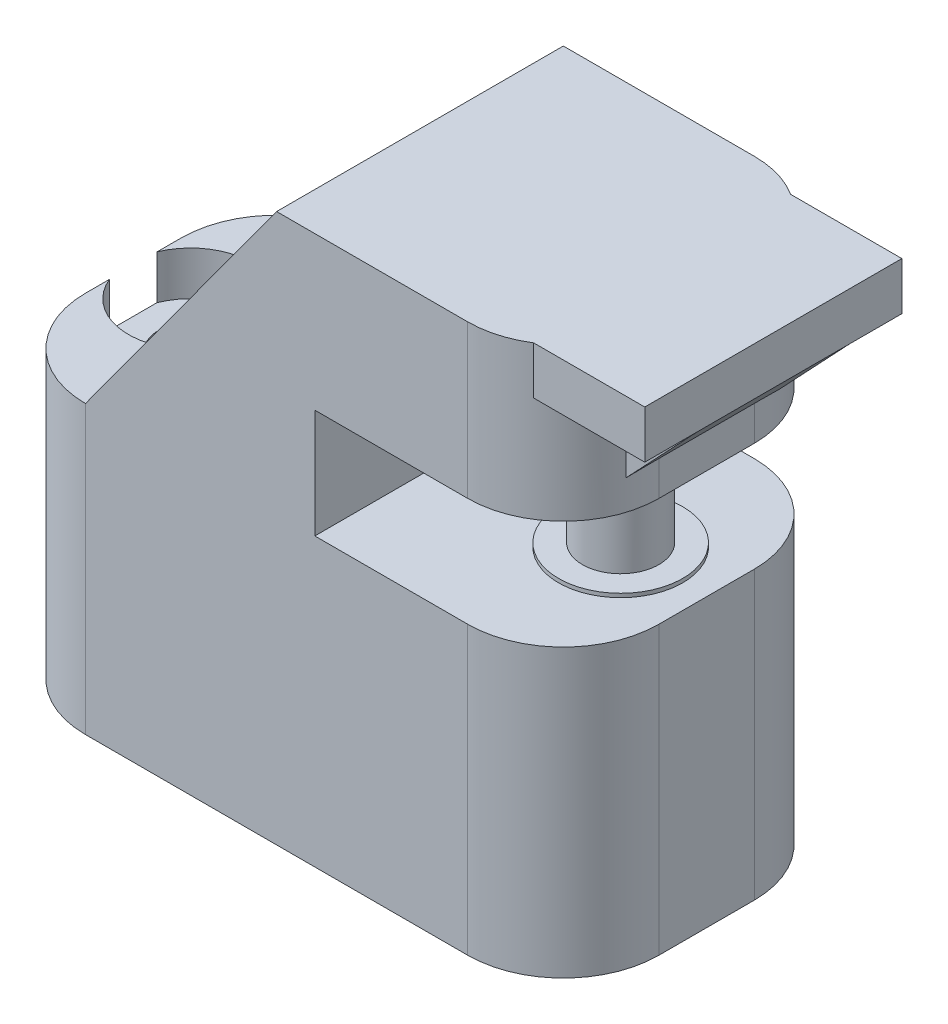
ISO-10303-21;
HEADER;
FILE_DESCRIPTION(('STEP AP214'),'2;1');
FILE_NAME('part.step','',(''),(''),'','','');
FILE_SCHEMA(('AUTOMOTIVE_DESIGN { 1 0 10303 214 1 1 1 1 }'));
ENDSEC;
DATA;
#1=APPLICATION_CONTEXT('core data for automotive mechanical design processes');
#2=APPLICATION_PROTOCOL_DEFINITION('international standard','automotive_design',2000,#1);
#3=PRODUCT_CONTEXT('',#1,'mechanical');
#4=PRODUCT('Part','Part','',(#3));
#5=PRODUCT_RELATED_PRODUCT_CATEGORY('part','',(#4));
#6=PRODUCT_DEFINITION_FORMATION('','',#4);
#7=PRODUCT_DEFINITION_CONTEXT('part definition',#1,'design');
#8=PRODUCT_DEFINITION('design','',#6,#7);
#9=PRODUCT_DEFINITION_SHAPE('','',#8);
#10=(LENGTH_UNIT() NAMED_UNIT(*) SI_UNIT(.MILLI.,.METRE.));
#11=(NAMED_UNIT(*) PLANE_ANGLE_UNIT() SI_UNIT($,.RADIAN.));
#12=(NAMED_UNIT(*) SI_UNIT($,.STERADIAN.) SOLID_ANGLE_UNIT());
#13=UNCERTAINTY_MEASURE_WITH_UNIT(LENGTH_MEASURE(1.E-05),#10,'distance_accuracy_value','');
#14=(GEOMETRIC_REPRESENTATION_CONTEXT(3) GLOBAL_UNCERTAINTY_ASSIGNED_CONTEXT((#13)) GLOBAL_UNIT_ASSIGNED_CONTEXT((#10,
#11,#12)) REPRESENTATION_CONTEXT('',''));
#15=CARTESIAN_POINT('',(0.,0.,0.));
#16=DIRECTION('',(0.,0.,1.));
#17=DIRECTION('',(1.,0.,0.));
#18=AXIS2_PLACEMENT_3D('',#15,#16,#17);
#19=CARTESIAN_POINT('',(0.,26.2,0.));
#20=DIRECTION('',(0.,-1.,0.));
#21=DIRECTION('',(0.,0.,-1.));
#22=AXIS2_PLACEMENT_3D('',#19,#20,#21);
#23=PLANE('',#22);
#24=DIRECTION('',(0.,0.,-1.));
#25=VECTOR('',#24,1.);
#26=CARTESIAN_POINT('',(33.4869107559231,26.2,0.77421994503107));
#27=LINE('',#26,#25);
#28=CARTESIAN_POINT('',(33.4869107559231,26.2,3.5));
#29=VERTEX_POINT('',#28);
#30=CARTESIAN_POINT('',(33.4869107559231,26.2,0.77421994503107));
#31=VERTEX_POINT('',#30);
#32=EDGE_CURVE('E233',#29,#31,#27,.T.);
#33=ORIENTED_EDGE('',*,*,#32,.F.);
#34=DIRECTION('',(-1.,0.,0.));
#35=VECTOR('',#34,1.);
#36=CARTESIAN_POINT('',(0.,26.2,3.5));
#37=LINE('',#36,#35);
#38=CARTESIAN_POINT('',(29.7696960070847,26.2,3.5));
#39=VERTEX_POINT('',#38);
#40=EDGE_CURVE('E57',#29,#39,#37,.T.);
#41=ORIENTED_EDGE('',*,*,#40,.T.);
#42=CARTESIAN_POINT('',(25.,26.2,5.));
#43=DIRECTION('',(0.,-1.,0.));
#44=DIRECTION('',(0.,0.,-1.));
#45=AXIS2_PLACEMENT_3D('',#42,#43,#44);
#46=CIRCLE('',#45,5.);
#47=CARTESIAN_POINT('',(27.6725985345777,26.2,0.774219945031071));
#48=VERTEX_POINT('',#47);
#49=EDGE_CURVE('E262',#39,#48,#46,.F.);
#50=ORIENTED_EDGE('',*,*,#49,.T.);
#51=DIRECTION('',(-1.,0.,0.));
#52=VECTOR('',#51,1.);
#53=CARTESIAN_POINT('',(33.4869107559231,26.2,0.77421994503107));
#54=LINE('',#53,#52);
#55=EDGE_CURVE('E235',#31,#48,#54,.T.);
#56=ORIENTED_EDGE('',*,*,#55,.F.);
#57=EDGE_LOOP('',(#33,#41,#50,#56));
#58=FACE_BOUND('',#57,.T.);
#59=ADVANCED_FACE('F49',(#58),#23,.T.);
#60=CARTESIAN_POINT('',(0.,15.,15.));
#61=DIRECTION('',(0.,-1.,0.));
#62=DIRECTION('',(0.,0.,-1.));
#63=AXIS2_PLACEMENT_3D('',#60,#61,#62);
#64=PLANE('',#63);
#65=DIRECTION('',(0.,0.,-1.));
#66=VECTOR('',#65,1.);
#67=CARTESIAN_POINT('',(5.,15.,15.));
#68=LINE('',#67,#66);
#69=CARTESIAN_POINT('',(5.,15.,15.));
#70=VERTEX_POINT('',#69);
#71=CARTESIAN_POINT('',(5.,15.,10.0617376914899));
#72=VERTEX_POINT('',#71);
#73=EDGE_CURVE('E374',#70,#72,#68,.T.);
#74=ORIENTED_EDGE('',*,*,#73,.T.);
#75=CARTESIAN_POINT('',(3.,15.,7.5));
#76=DIRECTION('',(0.,-1.,0.));
#77=DIRECTION('',(0.,0.,-1.));
#78=AXIS2_PLACEMENT_3D('',#75,#76,#77);
#79=CIRCLE('',#78,3.25);
#80=CARTESIAN_POINT('',(0.,15.,8.74999999999999));
#81=VERTEX_POINT('',#80);
#82=EDGE_CURVE('E494',#72,#81,#79,.T.);
#83=ORIENTED_EDGE('',*,*,#82,.T.);
#84=DIRECTION('',(0.,0.,-1.));
#85=VECTOR('',#84,1.);
#86=CARTESIAN_POINT('',(0.,15.,15.));
#87=LINE('',#86,#85);
#88=CARTESIAN_POINT('',(0.,15.,10.));
#89=VERTEX_POINT('',#88);
#90=EDGE_CURVE('E369',#89,#81,#87,.T.);
#91=ORIENTED_EDGE('',*,*,#90,.F.);
#92=CARTESIAN_POINT('',(5.,15.,10.));
#93=DIRECTION('',(0.,-1.,0.));
#94=DIRECTION('',(0.,0.,-1.));
#95=AXIS2_PLACEMENT_3D('',#92,#93,#94);
#96=CIRCLE('',#95,5.);
#97=EDGE_CURVE('E437',#89,#70,#96,.F.);
#98=ORIENTED_EDGE('',*,*,#97,.T.);
#99=EDGE_LOOP('',(#74,#83,#91,#98));
#100=FACE_BOUND('',#99,.T.);
#101=ADVANCED_FACE('F564',(#100),#64,.F.);
#102=CARTESIAN_POINT('',(30.,0.,15.));
#103=DIRECTION('',(0.,1.,0.));
#104=DIRECTION('',(-1.,0.,0.));
#105=AXIS2_PLACEMENT_3D('',#102,#103,#104);
#106=PLANE('',#105);
#107=CARTESIAN_POINT('',(10.,0.,7.5));
#108=DIRECTION('',(0.,1.,0.));
#109=DIRECTION('',(0.,0.,1.));
#110=AXIS2_PLACEMENT_3D('',#107,#108,#109);
#111=CIRCLE('',#110,1.69999999999999);
#112=CARTESIAN_POINT('',(10.,0.,9.19999999999999));
#113=VERTEX_POINT('',#112);
#114=EDGE_CURVE('E300',#113,#113,#111,.T.);
#115=ORIENTED_EDGE('',*,*,#114,.T.);
#116=EDGE_LOOP('',(#115));
#117=FACE_BOUND('',#116,.T.);
#118=CARTESIAN_POINT('',(5.,0.,10.));
#119=DIRECTION('',(0.,1.,0.));
#120=DIRECTION('',(-1.,0.,0.));
#121=AXIS2_PLACEMENT_3D('',#118,#119,#120);
#122=CIRCLE('',#121,5.);
#123=CARTESIAN_POINT('',(5.,0.,15.));
#124=VERTEX_POINT('',#123);
#125=CARTESIAN_POINT('',(0.,0.,10.));
#126=VERTEX_POINT('',#125);
#127=EDGE_CURVE('E421',#124,#126,#122,.F.);
#128=ORIENTED_EDGE('',*,*,#127,.T.);
#129=DIRECTION('',(0.,0.,-1.));
#130=VECTOR('',#129,1.);
#131=CARTESIAN_POINT('',(0.,0.,15.));
#132=LINE('',#131,#130);
#133=CARTESIAN_POINT('',(0.,0.,5.));
#134=VERTEX_POINT('',#133);
#135=EDGE_CURVE('E341',#126,#134,#132,.T.);
#136=ORIENTED_EDGE('',*,*,#135,.T.);
#137=CARTESIAN_POINT('',(5.,0.,5.));
#138=DIRECTION('',(0.,1.,0.));
#139=DIRECTION('',(-1.,0.,0.));
#140=AXIS2_PLACEMENT_3D('',#137,#138,#139);
#141=CIRCLE('',#140,5.);
#142=CARTESIAN_POINT('',(5.,0.,0.));
#143=VERTEX_POINT('',#142);
#144=EDGE_CURVE('E424',#134,#143,#141,.F.);
#145=ORIENTED_EDGE('',*,*,#144,.T.);
#146=DIRECTION('',(1.,0.,0.));
#147=VECTOR('',#146,1.);
#148=CARTESIAN_POINT('',(30.,0.,0.));
#149=LINE('',#148,#147);
#150=CARTESIAN_POINT('',(25.,0.,0.));
#151=VERTEX_POINT('',#150);
#152=EDGE_CURVE('E342',#143,#151,#149,.T.);
#153=ORIENTED_EDGE('',*,*,#152,.T.);
#154=CARTESIAN_POINT('',(25.,0.,5.));
#155=DIRECTION('',(0.,1.,0.));
#156=DIRECTION('',(-1.,0.,0.));
#157=AXIS2_PLACEMENT_3D('',#154,#155,#156);
#158=CIRCLE('',#157,5.);
#159=CARTESIAN_POINT('',(30.,0.,5.));
#160=VERTEX_POINT('',#159);
#161=EDGE_CURVE('E418',#151,#160,#158,.F.);
#162=ORIENTED_EDGE('',*,*,#161,.T.);
#163=DIRECTION('',(0.,0.,-1.));
#164=VECTOR('',#163,1.);
#165=CARTESIAN_POINT('',(30.,0.,15.));
#166=LINE('',#165,#164);
#167=CARTESIAN_POINT('',(30.,0.,10.));
#168=VERTEX_POINT('',#167);
#169=EDGE_CURVE('E394',#168,#160,#166,.T.);
#170=ORIENTED_EDGE('',*,*,#169,.F.);
#171=CARTESIAN_POINT('',(25.,0.,10.));
#172=DIRECTION('',(0.,1.,0.));
#173=DIRECTION('',(-1.,0.,0.));
#174=AXIS2_PLACEMENT_3D('',#171,#172,#173);
#175=CIRCLE('',#174,5.);
#176=CARTESIAN_POINT('',(25.,0.,15.));
#177=VERTEX_POINT('',#176);
#178=EDGE_CURVE('E415',#168,#177,#175,.F.);
#179=ORIENTED_EDGE('',*,*,#178,.T.);
#180=DIRECTION('',(1.,0.,0.));
#181=VECTOR('',#180,1.);
#182=CARTESIAN_POINT('',(30.,0.,15.));
#183=LINE('',#182,#181);
#184=EDGE_CURVE('E319',#124,#177,#183,.T.);
#185=ORIENTED_EDGE('',*,*,#184,.F.);
#186=EDGE_LOOP('',(#128,#136,#145,#153,#162,#170,#179,#185));
#187=FACE_BOUND('',#186,.T.);
#188=CARTESIAN_POINT('',(3.,0.,7.5));
#189=DIRECTION('',(0.,1.,0.));
#190=DIRECTION('',(0.,0.,1.));
#191=AXIS2_PLACEMENT_3D('',#188,#189,#190);
#192=CIRCLE('',#191,1.69999999999999);
#193=CARTESIAN_POINT('',(3.,0.,9.19999999999999));
#194=VERTEX_POINT('',#193);
#195=EDGE_CURVE('E278',#194,#194,#192,.T.);
#196=ORIENTED_EDGE('',*,*,#195,.T.);
#197=EDGE_LOOP('',(#196));
#198=FACE_BOUND('',#197,.T.);
#199=ADVANCED_FACE('F568',(#117,#187,#198),#106,.F.);
#200=CARTESIAN_POINT('',(30.,15.,15.));
#201=DIRECTION('',(-1.,0.,0.));
#202=DIRECTION('',(0.,-1.,0.));
#203=AXIS2_PLACEMENT_3D('',#200,#201,#202);
#204=PLANE('',#203);
#205=ORIENTED_EDGE('',*,*,#169,.T.);
#206=DIRECTION('',(0.,1.,0.));
#207=VECTOR('',#206,1.);
#208=CARTESIAN_POINT('',(30.,15.,5.));
#209=LINE('',#208,#207);
#210=CARTESIAN_POINT('',(30.,15.,5.));
#211=VERTEX_POINT('',#210);
#212=EDGE_CURVE('E478',#160,#211,#209,.T.);
#213=ORIENTED_EDGE('',*,*,#212,.T.);
#214=DIRECTION('',(0.,0.,-1.));
#215=VECTOR('',#214,1.);
#216=CARTESIAN_POINT('',(30.,15.,15.));
#217=LINE('',#216,#215);
#218=CARTESIAN_POINT('',(30.,15.,10.));
#219=VERTEX_POINT('',#218);
#220=EDGE_CURVE('E390',#219,#211,#217,.T.);
#221=ORIENTED_EDGE('',*,*,#220,.F.);
#222=DIRECTION('',(0.,1.,0.));
#223=VECTOR('',#222,1.);
#224=CARTESIAN_POINT('',(30.,15.,10.));
#225=LINE('',#224,#223);
#226=EDGE_CURVE('E475',#219,#168,#225,.F.);
#227=ORIENTED_EDGE('',*,*,#226,.T.);
#228=EDGE_LOOP('',(#205,#213,#221,#227));
#229=FACE_BOUND('',#228,.T.);
#230=ADVANCED_FACE('F890',(#229),#204,.F.);
#231=CARTESIAN_POINT('',(17.,15.,15.));
#232=DIRECTION('',(0.,-1.,0.));
#233=DIRECTION('',(0.,0.,-1.));
#234=AXIS2_PLACEMENT_3D('',#231,#232,#233);
#235=PLANE('',#234);
#236=CARTESIAN_POINT('',(25.5,15.,7.5));
#237=DIRECTION('',(0.,-1.,0.));
#238=DIRECTION('',(0.,0.,-1.));
#239=AXIS2_PLACEMENT_3D('',#236,#237,#238);
#240=CIRCLE('',#239,3.25);
#241=CARTESIAN_POINT('',(25.5,15.,4.25));
#242=VERTEX_POINT('',#241);
#243=EDGE_CURVE('E398',#242,#242,#240,.F.);
#244=ORIENTED_EDGE('',*,*,#243,.F.);
#245=EDGE_LOOP('',(#244));
#246=FACE_BOUND('',#245,.T.);
#247=DIRECTION('',(-1.,0.,0.));
#248=VECTOR('',#247,1.);
#249=CARTESIAN_POINT('',(17.,15.,0.));
#250=LINE('',#249,#248);
#251=CARTESIAN_POINT('',(25.,15.,0.));
#252=VERTEX_POINT('',#251);
#253=CARTESIAN_POINT('',(17.,15.,0.));
#254=VERTEX_POINT('',#253);
#255=EDGE_CURVE('E346',#252,#254,#250,.T.);
#256=ORIENTED_EDGE('',*,*,#255,.T.);
#257=DIRECTION('',(0.,0.,-1.));
#258=VECTOR('',#257,1.);
#259=CARTESIAN_POINT('',(17.,15.,15.));
#260=LINE('',#259,#258);
#261=CARTESIAN_POINT('',(17.,15.,15.));
#262=VERTEX_POINT('',#261);
#263=EDGE_CURVE('E387',#262,#254,#260,.T.);
#264=ORIENTED_EDGE('',*,*,#263,.F.);
#265=DIRECTION('',(-1.,0.,0.));
#266=VECTOR('',#265,1.);
#267=CARTESIAN_POINT('',(17.,15.,15.));
#268=LINE('',#267,#266);
#269=CARTESIAN_POINT('',(25.,15.,15.));
#270=VERTEX_POINT('',#269);
#271=EDGE_CURVE('E323',#270,#262,#268,.T.);
#272=ORIENTED_EDGE('',*,*,#271,.F.);
#273=CARTESIAN_POINT('',(25.,15.,10.));
#274=DIRECTION('',(0.,-1.,0.));
#275=DIRECTION('',(0.,0.,-1.));
#276=AXIS2_PLACEMENT_3D('',#273,#274,#275);
#277=CIRCLE('',#276,5.);
#278=EDGE_CURVE('E482',#270,#219,#277,.F.);
#279=ORIENTED_EDGE('',*,*,#278,.T.);
#280=ORIENTED_EDGE('',*,*,#220,.T.);
#281=CARTESIAN_POINT('',(25.,15.,5.));
#282=DIRECTION('',(0.,-1.,0.));
#283=DIRECTION('',(0.,0.,-1.));
#284=AXIS2_PLACEMENT_3D('',#281,#282,#283);
#285=CIRCLE('',#284,5.);
#286=EDGE_CURVE('E485',#211,#252,#285,.F.);
#287=ORIENTED_EDGE('',*,*,#286,.T.);
#288=EDGE_LOOP('',(#256,#264,#272,#279,#280,#287));
#289=FACE_BOUND('',#288,.T.);
#290=ADVANCED_FACE('F881',(#246,#289),#235,.F.);
#291=CARTESIAN_POINT('',(17.,20.7,15.));
#292=DIRECTION('',(-1.,0.,0.));
#293=DIRECTION('',(0.,-1.,0.));
#294=AXIS2_PLACEMENT_3D('',#291,#292,#293);
#295=PLANE('',#294);
#296=ORIENTED_EDGE('',*,*,#263,.T.);
#297=DIRECTION('',(0.,1.,0.));
#298=VECTOR('',#297,1.);
#299=CARTESIAN_POINT('',(17.,20.7,0.));
#300=LINE('',#299,#298);
#301=CARTESIAN_POINT('',(17.,20.7,0.));
#302=VERTEX_POINT('',#301);
#303=EDGE_CURVE('E350',#254,#302,#300,.T.);
#304=ORIENTED_EDGE('',*,*,#303,.T.);
#305=DIRECTION('',(0.,0.,-1.));
#306=VECTOR('',#305,1.);
#307=CARTESIAN_POINT('',(17.,20.7,15.));
#308=LINE('',#307,#306);
#309=CARTESIAN_POINT('',(17.,20.7,15.));
#310=VERTEX_POINT('',#309);
#311=EDGE_CURVE('E384',#310,#302,#308,.T.);
#312=ORIENTED_EDGE('',*,*,#311,.F.);
#313=DIRECTION('',(0.,1.,0.));
#314=VECTOR('',#313,1.);
#315=CARTESIAN_POINT('',(17.,20.7,15.));
#316=LINE('',#315,#314);
#317=EDGE_CURVE('E327',#262,#310,#316,.T.);
#318=ORIENTED_EDGE('',*,*,#317,.F.);
#319=EDGE_LOOP('',(#296,#304,#312,#318));
#320=FACE_BOUND('',#319,.T.);
#321=ADVANCED_FACE('F534',(#320),#295,.F.);
#322=CARTESIAN_POINT('',(30.,20.7,15.));
#323=DIRECTION('',(0.,1.,0.));
#324=DIRECTION('',(0.,0.,1.));
#325=AXIS2_PLACEMENT_3D('',#322,#323,#324);
#326=PLANE('',#325);
#327=CARTESIAN_POINT('',(25.5,20.7,7.5));
#328=DIRECTION('',(0.,1.,0.));
#329=DIRECTION('',(-1.,0.,0.));
#330=AXIS2_PLACEMENT_3D('',#327,#328,#329);
#331=CIRCLE('',#330,3.25);
#332=CARTESIAN_POINT('',(22.25,20.7,7.5));
#333=VERTEX_POINT('',#332);
#334=EDGE_CURVE('E310',#333,#333,#331,.T.);
#335=ORIENTED_EDGE('',*,*,#334,.T.);
#336=EDGE_LOOP('',(#335));
#337=FACE_BOUND('',#336,.T.);
#338=ORIENTED_EDGE('',*,*,#311,.T.);
#339=DIRECTION('',(1.,0.,0.));
#340=VECTOR('',#339,1.);
#341=CARTESIAN_POINT('',(30.,20.7,0.));
#342=LINE('',#341,#340);
#343=CARTESIAN_POINT('',(25.,20.7,0.));
#344=VERTEX_POINT('',#343);
#345=EDGE_CURVE('E354',#302,#344,#342,.T.);
#346=ORIENTED_EDGE('',*,*,#345,.T.);
#347=CARTESIAN_POINT('',(25.,20.7,5.));
#348=DIRECTION('',(0.,1.,0.));
#349=DIRECTION('',(0.,0.,1.));
#350=AXIS2_PLACEMENT_3D('',#347,#348,#349);
#351=CIRCLE('',#350,5.);
#352=CARTESIAN_POINT('',(30.,20.7,5.));
#353=VERTEX_POINT('',#352);
#354=EDGE_CURVE('E472',#344,#353,#351,.F.);
#355=ORIENTED_EDGE('',*,*,#354,.T.);
#356=DIRECTION('',(0.,0.,-1.));
#357=VECTOR('',#356,1.);
#358=CARTESIAN_POINT('',(30.,20.7,15.));
#359=LINE('',#358,#357);
#360=CARTESIAN_POINT('',(30.,20.7,10.));
#361=VERTEX_POINT('',#360);
#362=EDGE_CURVE('E380',#361,#353,#359,.T.);
#363=ORIENTED_EDGE('',*,*,#362,.F.);
#364=CARTESIAN_POINT('',(25.,20.7,10.));
#365=DIRECTION('',(0.,1.,0.));
#366=DIRECTION('',(0.,0.,1.));
#367=AXIS2_PLACEMENT_3D('',#364,#365,#366);
#368=CIRCLE('',#367,5.);
#369=CARTESIAN_POINT('',(25.,20.7,15.));
#370=VERTEX_POINT('',#369);
#371=EDGE_CURVE('E469',#361,#370,#368,.F.);
#372=ORIENTED_EDGE('',*,*,#371,.T.);
#373=DIRECTION('',(1.,0.,0.));
#374=VECTOR('',#373,1.);
#375=CARTESIAN_POINT('',(30.,20.7,15.));
#376=LINE('',#375,#374);
#377=EDGE_CURVE('E330',#310,#370,#376,.T.);
#378=ORIENTED_EDGE('',*,*,#377,.F.);
#379=EDGE_LOOP('',(#338,#346,#355,#363,#372,#378));
#380=FACE_BOUND('',#379,.T.);
#381=ADVANCED_FACE('F525',(#337,#380),#326,.F.);
#382=CARTESIAN_POINT('',(30.,28.7,15.));
#383=DIRECTION('',(-1.,0.,0.));
#384=DIRECTION('',(0.,0.,1.));
#385=AXIS2_PLACEMENT_3D('',#382,#383,#384);
#386=PLANE('',#385);
#387=DIRECTION('',(0.,1.,0.));
#388=VECTOR('',#387,1.);
#389=CARTESIAN_POINT('',(30.,28.7,5.));
#390=LINE('',#389,#388);
#391=CARTESIAN_POINT('',(30.,22.50746824119,5.));
#392=VERTEX_POINT('',#391);
#393=EDGE_CURVE('E458',#353,#392,#390,.T.);
#394=ORIENTED_EDGE('',*,*,#393,.T.);
#395=DIRECTION('',(0.,0.,-1.));
#396=VECTOR('',#395,1.);
#397=CARTESIAN_POINT('',(30.,22.50746824119,15.));
#398=LINE('',#397,#396);
#399=CARTESIAN_POINT('',(30.,22.50746824119,10.));
#400=VERTEX_POINT('',#399);
#401=EDGE_CURVE('E513',#392,#400,#398,.F.);
#402=ORIENTED_EDGE('',*,*,#401,.T.);
#403=DIRECTION('',(0.,1.,0.));
#404=VECTOR('',#403,1.);
#405=CARTESIAN_POINT('',(30.,28.7,10.));
#406=LINE('',#405,#404);
#407=EDGE_CURVE('E455',#400,#361,#406,.F.);
#408=ORIENTED_EDGE('',*,*,#407,.T.);
#409=ORIENTED_EDGE('',*,*,#362,.T.);
#410=EDGE_LOOP('',(#394,#402,#408,#409));
#411=FACE_BOUND('',#410,.T.);
#412=ADVANCED_FACE('F518',(#411),#386,.F.);
#413=CARTESIAN_POINT('',(15.,28.7,15.));
#414=DIRECTION('',(0.,-1.,0.));
#415=DIRECTION('',(0.,0.,-1.));
#416=AXIS2_PLACEMENT_3D('',#413,#414,#415);
#417=PLANE('',#416);
#418=DIRECTION('',(0.,0.,-1.));
#419=VECTOR('',#418,1.);
#420=CARTESIAN_POINT('',(33.4869107559231,28.7,0.77421994503107));
#421=LINE('',#420,#419);
#422=CARTESIAN_POINT('',(33.4869107559231,28.7,14.2257800549689));
#423=VERTEX_POINT('',#422);
#424=CARTESIAN_POINT('',(33.4869107559231,28.7,0.77421994503107));
#425=VERTEX_POINT('',#424);
#426=EDGE_CURVE('E253',#423,#425,#421,.T.);
#427=ORIENTED_EDGE('',*,*,#426,.T.);
#428=DIRECTION('',(-1.,0.,0.));
#429=VECTOR('',#428,1.);
#430=CARTESIAN_POINT('',(33.4869107559231,28.7,0.77421994503107));
#431=LINE('',#430,#429);
#432=CARTESIAN_POINT('',(27.6725985345777,28.7,0.774219945031071));
#433=VERTEX_POINT('',#432);
#434=EDGE_CURVE('E255',#425,#433,#431,.T.);
#435=ORIENTED_EDGE('',*,*,#434,.T.);
#436=CARTESIAN_POINT('',(25.,28.7,5.));
#437=DIRECTION('',(0.,-1.,0.));
#438=DIRECTION('',(0.,0.,-1.));
#439=AXIS2_PLACEMENT_3D('',#436,#437,#438);
#440=CIRCLE('',#439,5.);
#441=CARTESIAN_POINT('',(25.,28.7,0.));
#442=VERTEX_POINT('',#441);
#443=EDGE_CURVE('E466',#433,#442,#440,.F.);
#444=ORIENTED_EDGE('',*,*,#443,.T.);
#445=DIRECTION('',(-1.,0.,0.));
#446=VECTOR('',#445,1.);
#447=CARTESIAN_POINT('',(15.,28.7,0.));
#448=LINE('',#447,#446);
#449=CARTESIAN_POINT('',(15.,28.7,0.));
#450=VERTEX_POINT('',#449);
#451=EDGE_CURVE('E358',#442,#450,#448,.T.);
#452=ORIENTED_EDGE('',*,*,#451,.T.);
#453=DIRECTION('',(0.,0.,-1.));
#454=VECTOR('',#453,1.);
#455=CARTESIAN_POINT('',(15.,28.7,15.));
#456=LINE('',#455,#454);
#457=CARTESIAN_POINT('',(15.,28.7,15.));
#458=VERTEX_POINT('',#457);
#459=EDGE_CURVE('E377',#458,#450,#456,.T.);
#460=ORIENTED_EDGE('',*,*,#459,.F.);
#461=DIRECTION('',(-1.,0.,0.));
#462=VECTOR('',#461,1.);
#463=CARTESIAN_POINT('',(15.,28.7,15.));
#464=LINE('',#463,#462);
#465=CARTESIAN_POINT('',(25.,28.7,15.));
#466=VERTEX_POINT('',#465);
#467=EDGE_CURVE('E334',#466,#458,#464,.T.);
#468=ORIENTED_EDGE('',*,*,#467,.F.);
#469=CARTESIAN_POINT('',(25.,28.7,10.));
#470=DIRECTION('',(0.,-1.,0.));
#471=DIRECTION('',(0.,0.,-1.));
#472=AXIS2_PLACEMENT_3D('',#469,#470,#471);
#473=CIRCLE('',#472,5.);
#474=CARTESIAN_POINT('',(27.6725985345777,28.7,14.2257800549689));
#475=VERTEX_POINT('',#474);
#476=EDGE_CURVE('E462',#466,#475,#473,.F.);
#477=ORIENTED_EDGE('',*,*,#476,.T.);
#478=DIRECTION('',(1.,0.,0.));
#479=VECTOR('',#478,1.);
#480=CARTESIAN_POINT('',(33.4869107559231,28.7,14.2257800549689));
#481=LINE('',#480,#479);
#482=EDGE_CURVE('E239',#475,#423,#481,.T.);
#483=ORIENTED_EDGE('',*,*,#482,.T.);
#484=EDGE_LOOP('',(#427,#435,#444,#452,#460,#468,#477,#483));
#485=FACE_BOUND('',#484,.T.);
#486=ADVANCED_FACE('F549',(#485),#417,.F.);
#487=CARTESIAN_POINT('',(5.,15.,15.));
#488=DIRECTION('',(0.807715066657862,-0.589573041356104,0.));
#489=DIRECTION('',(0.589573041356104,0.807715066657862,0.));
#490=AXIS2_PLACEMENT_3D('',#487,#488,#489);
#491=PLANE('',#490);
#492=ORIENTED_EDGE('',*,*,#459,.T.);
#493=DIRECTION('',(-0.589573041356104,-0.807715066657862,0.));
#494=VECTOR('',#493,1.);
#495=CARTESIAN_POINT('',(5.,15.,0.));
#496=LINE('',#495,#494);
#497=CARTESIAN_POINT('',(5.,15.,0.));
#498=VERTEX_POINT('',#497);
#499=EDGE_CURVE('E324',#450,#498,#496,.T.);
#500=ORIENTED_EDGE('',*,*,#499,.T.);
#501=CARTESIAN_POINT('',(5.,15.,4.93826230851011));
#502=VERTEX_POINT('',#501);
#503=EDGE_CURVE('E373',#502,#498,#68,.T.);
#504=ORIENTED_EDGE('',*,*,#503,.F.);
#505=CARTESIAN_POINT('',(3.,12.26,7.5));
#506=DIRECTION('',(0.807715066657862,-0.589573041356104,0.));
#507=DIRECTION('',(0.589573041356104,0.807715066657862,0.));
#508=AXIS2_PLACEMENT_3D('',#505,#506,#507);
#509=ELLIPSE('',#508,5.51246371870146,3.25);
#510=EDGE_CURVE('E72',#502,#72,#509,.T.);
#511=ORIENTED_EDGE('',*,*,#510,.T.);
#512=ORIENTED_EDGE('',*,*,#73,.F.);
#513=DIRECTION('',(-0.589573041356104,-0.807715066657862,0.));
#514=VECTOR('',#513,1.);
#515=CARTESIAN_POINT('',(5.,15.,15.));
#516=LINE('',#515,#514);
#517=EDGE_CURVE('E337',#458,#70,#516,.T.);
#518=ORIENTED_EDGE('',*,*,#517,.F.);
#519=EDGE_LOOP('',(#492,#500,#504,#511,#512,#518));
#520=FACE_BOUND('',#519,.T.);
#521=CARTESIAN_POINT('',(10.,21.85,7.5));
#522=DIRECTION('',(0.807715066657862,-0.589573041356104,0.));
#523=DIRECTION('',(0.589573041356104,0.807715066657862,0.));
#524=AXIS2_PLACEMENT_3D('',#521,#522,#523);
#525=ELLIPSE('',#524,5.51246371870146,3.25);
#526=CARTESIAN_POINT('',(13.25,26.3025,7.5));
#527=VERTEX_POINT('',#526);
#528=EDGE_CURVE('E304',#527,#527,#525,.T.);
#529=ORIENTED_EDGE('',*,*,#528,.T.);
#530=EDGE_LOOP('',(#529));
#531=FACE_BOUND('',#530,.T.);
#532=ADVANCED_FACE('F631',(#520,#531),#491,.F.);
#533=ORIENTED_EDGE('',*,*,#503,.T.);
#534=CARTESIAN_POINT('',(5.,15.,5.));
#535=DIRECTION('',(0.,-1.,0.));
#536=DIRECTION('',(0.,0.,-1.));
#537=AXIS2_PLACEMENT_3D('',#534,#535,#536);
#538=CIRCLE('',#537,5.);
#539=CARTESIAN_POINT('',(0.,15.,5.));
#540=VERTEX_POINT('',#539);
#541=EDGE_CURVE('E440',#498,#540,#538,.F.);
#542=ORIENTED_EDGE('',*,*,#541,.T.);
#543=CARTESIAN_POINT('',(0.,15.,6.25000000000001));
#544=VERTEX_POINT('',#543);
#545=EDGE_CURVE('E368',#544,#540,#87,.T.);
#546=ORIENTED_EDGE('',*,*,#545,.F.);
#547=EDGE_CURVE('E488',#544,#502,#79,.T.);
#548=ORIENTED_EDGE('',*,*,#547,.T.);
#549=EDGE_LOOP('',(#533,#542,#546,#548));
#550=FACE_BOUND('',#549,.T.);
#551=ADVANCED_FACE('F571',(#550),#64,.F.);
#552=CARTESIAN_POINT('',(0.,0.,15.));
#553=DIRECTION('',(1.,0.,0.));
#554=DIRECTION('',(0.,0.,-1.));
#555=AXIS2_PLACEMENT_3D('',#552,#553,#554);
#556=PLANE('',#555);
#557=DIRECTION('',(0.,0.,-1.));
#558=VECTOR('',#557,1.);
#559=CARTESIAN_POINT('',(0.,12.7,15.));
#560=LINE('',#559,#558);
#561=CARTESIAN_POINT('',(0.,12.7,8.74999999999999));
#562=VERTEX_POINT('',#561);
#563=CARTESIAN_POINT('',(0.,12.7,6.25000000000001));
#564=VERTEX_POINT('',#563);
#565=EDGE_CURVE('E495',#562,#564,#560,.T.);
#566=ORIENTED_EDGE('',*,*,#565,.T.);
#567=DIRECTION('',(0.,1.,0.));
#568=VECTOR('',#567,1.);
#569=CARTESIAN_POINT('',(0.,28.7,6.25000000000001));
#570=LINE('',#569,#568);
#571=EDGE_CURVE('E282',#564,#544,#570,.T.);
#572=ORIENTED_EDGE('',*,*,#571,.T.);
#573=ORIENTED_EDGE('',*,*,#545,.T.);
#574=DIRECTION('',(0.,-1.,0.));
#575=VECTOR('',#574,1.);
#576=CARTESIAN_POINT('',(0.,0.,5.));
#577=LINE('',#576,#575);
#578=EDGE_CURVE('E411',#540,#134,#577,.T.);
#579=ORIENTED_EDGE('',*,*,#578,.T.);
#580=ORIENTED_EDGE('',*,*,#135,.F.);
#581=DIRECTION('',(0.,-1.,0.));
#582=VECTOR('',#581,1.);
#583=CARTESIAN_POINT('',(0.,0.,10.));
#584=LINE('',#583,#582);
#585=EDGE_CURVE('E405',#126,#89,#584,.F.);
#586=ORIENTED_EDGE('',*,*,#585,.T.);
#587=ORIENTED_EDGE('',*,*,#90,.T.);
#588=DIRECTION('',(0.,1.,0.));
#589=VECTOR('',#588,1.);
#590=CARTESIAN_POINT('',(0.,28.7,8.74999999999999));
#591=LINE('',#590,#589);
#592=EDGE_CURVE('E288',#81,#562,#591,.F.);
#593=ORIENTED_EDGE('',*,*,#592,.T.);
#594=EDGE_LOOP('',(#566,#572,#573,#579,#580,#586,#587,#593));
#595=FACE_BOUND('',#594,.T.);
#596=ADVANCED_FACE('F827',(#595),#556,.F.);
#597=CARTESIAN_POINT('',(0.,0.,15.));
#598=DIRECTION('',(0.,0.,-1.));
#599=DIRECTION('',(-1.,0.,0.));
#600=AXIS2_PLACEMENT_3D('',#597,#598,#599);
#601=PLANE('',#600);
#602=ORIENTED_EDGE('',*,*,#517,.T.);
#603=DIRECTION('',(0.,-1.,0.));
#604=VECTOR('',#603,1.);
#605=CARTESIAN_POINT('',(5.,0.,15.));
#606=LINE('',#605,#604);
#607=EDGE_CURVE('E451',#70,#124,#606,.T.);
#608=ORIENTED_EDGE('',*,*,#607,.T.);
#609=ORIENTED_EDGE('',*,*,#184,.T.);
#610=DIRECTION('',(0.,1.,0.));
#611=VECTOR('',#610,1.);
#612=CARTESIAN_POINT('',(25.,0.,15.));
#613=LINE('',#612,#611);
#614=EDGE_CURVE('E443',#177,#270,#613,.T.);
#615=ORIENTED_EDGE('',*,*,#614,.T.);
#616=ORIENTED_EDGE('',*,*,#271,.T.);
#617=ORIENTED_EDGE('',*,*,#317,.T.);
#618=ORIENTED_EDGE('',*,*,#377,.T.);
#619=DIRECTION('',(0.,1.,0.));
#620=VECTOR('',#619,1.);
#621=CARTESIAN_POINT('',(25.,0.,15.));
#622=LINE('',#621,#620);
#623=EDGE_CURVE('E447',#370,#466,#622,.T.);
#624=ORIENTED_EDGE('',*,*,#623,.T.);
#625=ORIENTED_EDGE('',*,*,#467,.T.);
#626=EDGE_LOOP('',(#602,#608,#609,#615,#616,#617,#618,#624,#625));
#627=FACE_BOUND('',#626,.T.);
#628=ADVANCED_FACE('F527',(#627),#601,.F.);
#629=CARTESIAN_POINT('',(0.,0.,0.));
#630=DIRECTION('',(0.,0.,-1.));
#631=DIRECTION('',(-1.,0.,0.));
#632=AXIS2_PLACEMENT_3D('',#629,#630,#631);
#633=PLANE('',#632);
#634=ORIENTED_EDGE('',*,*,#152,.F.);
#635=DIRECTION('',(0.,-1.,0.));
#636=VECTOR('',#635,1.);
#637=CARTESIAN_POINT('',(5.,15.,0.));
#638=LINE('',#637,#636);
#639=EDGE_CURVE('E433',#143,#498,#638,.F.);
#640=ORIENTED_EDGE('',*,*,#639,.T.);
#641=ORIENTED_EDGE('',*,*,#499,.F.);
#642=ORIENTED_EDGE('',*,*,#451,.F.);
#643=DIRECTION('',(0.,1.,0.));
#644=VECTOR('',#643,1.);
#645=CARTESIAN_POINT('',(25.,20.7,0.));
#646=LINE('',#645,#644);
#647=EDGE_CURVE('E430',#442,#344,#646,.F.);
#648=ORIENTED_EDGE('',*,*,#647,.T.);
#649=ORIENTED_EDGE('',*,*,#345,.F.);
#650=ORIENTED_EDGE('',*,*,#303,.F.);
#651=ORIENTED_EDGE('',*,*,#255,.F.);
#652=DIRECTION('',(0.,1.,0.));
#653=VECTOR('',#652,1.);
#654=CARTESIAN_POINT('',(25.,0.,0.));
#655=LINE('',#654,#653);
#656=EDGE_CURVE('E427',#252,#151,#655,.F.);
#657=ORIENTED_EDGE('',*,*,#656,.T.);
#658=EDGE_LOOP('',(#634,#640,#641,#642,#648,#649,#650,#651,#657));
#659=FACE_BOUND('',#658,.T.);
#660=ADVANCED_FACE('F809',(#659),#633,.T.);
#661=CARTESIAN_POINT('',(25.5,28.702,7.5));
#662=DIRECTION('',(0.,-1.,0.));
#663=DIRECTION('',(0.,0.,-1.));
#664=AXIS2_PLACEMENT_3D('',#661,#662,#663);
#665=CYLINDRICAL_SURFACE('',#664,2.);
#666=CARTESIAN_POINT('',(25.5,15.2,7.5));
#667=DIRECTION('',(0.,1.,0.));
#668=DIRECTION('',(-1.,0.,0.));
#669=AXIS2_PLACEMENT_3D('',#666,#667,#668);
#670=CIRCLE('',#669,2.);
#671=CARTESIAN_POINT('',(23.5,15.2,7.5));
#672=VERTEX_POINT('',#671);
#673=EDGE_CURVE('E318',#672,#672,#670,.T.);
#674=ORIENTED_EDGE('',*,*,#673,.T.);
#675=EDGE_LOOP('',(#674));
#676=FACE_BOUND('',#675,.T.);
#677=CARTESIAN_POINT('',(25.5,20.5,7.5));
#678=DIRECTION('',(0.,-1.,0.));
#679=DIRECTION('',(1.,0.,0.));
#680=AXIS2_PLACEMENT_3D('',#677,#678,#679);
#681=CIRCLE('',#680,2.);
#682=CARTESIAN_POINT('',(27.5,20.5,7.5));
#683=VERTEX_POINT('',#682);
#684=EDGE_CURVE('E309',#683,#683,#681,.T.);
#685=ORIENTED_EDGE('',*,*,#684,.T.);
#686=EDGE_LOOP('',(#685));
#687=FACE_BOUND('',#686,.T.);
#688=ADVANCED_FACE('F799',(#676,#687),#665,.T.);
#689=CARTESIAN_POINT('',(25.5,15.2,7.5));
#690=DIRECTION('',(0.,-1.,0.));
#691=DIRECTION('',(1.,0.,0.));
#692=AXIS2_PLACEMENT_3D('',#689,#690,#691);
#693=CYLINDRICAL_SURFACE('',#692,3.25);
#694=CARTESIAN_POINT('',(25.5,15.2,7.5));
#695=DIRECTION('',(0.,1.,0.));
#696=DIRECTION('',(-1.,0.,0.));
#697=AXIS2_PLACEMENT_3D('',#694,#695,#696);
#698=CIRCLE('',#697,3.25);
#699=CARTESIAN_POINT('',(22.25,15.2,7.5));
#700=VERTEX_POINT('',#699);
#701=EDGE_CURVE('E314',#700,#700,#698,.T.);
#702=ORIENTED_EDGE('',*,*,#701,.F.);
#703=EDGE_LOOP('',(#702));
#704=FACE_BOUND('',#703,.T.);
#705=ORIENTED_EDGE('',*,*,#243,.T.);
#706=EDGE_LOOP('',(#705));
#707=FACE_BOUND('',#706,.T.);
#708=ADVANCED_FACE('F789',(#704,#707),#693,.T.);
#709=CARTESIAN_POINT('',(25.5,15.2,7.5));
#710=DIRECTION('',(0.,1.,0.));
#711=DIRECTION('',(-1.,0.,0.));
#712=AXIS2_PLACEMENT_3D('',#709,#710,#711);
#713=PLANE('',#712);
#714=ORIENTED_EDGE('',*,*,#701,.T.);
#715=EDGE_LOOP('',(#714));
#716=FACE_BOUND('',#715,.T.);
#717=ORIENTED_EDGE('',*,*,#673,.F.);
#718=EDGE_LOOP('',(#717));
#719=FACE_BOUND('',#718,.T.);
#720=ADVANCED_FACE('F779',(#716,#719),#713,.T.);
#721=CARTESIAN_POINT('',(25.5,20.5,7.5));
#722=DIRECTION('',(0.,1.,0.));
#723=DIRECTION('',(-1.,0.,0.));
#724=AXIS2_PLACEMENT_3D('',#721,#722,#723);
#725=CYLINDRICAL_SURFACE('',#724,3.25);
#726=CARTESIAN_POINT('',(25.5,20.5,7.5));
#727=DIRECTION('',(0.,1.,0.));
#728=DIRECTION('',(-1.,0.,0.));
#729=AXIS2_PLACEMENT_3D('',#726,#727,#728);
#730=CIRCLE('',#729,3.25);
#731=CARTESIAN_POINT('',(22.25,20.5,7.5));
#732=VERTEX_POINT('',#731);
#733=EDGE_CURVE('E305',#732,#732,#730,.T.);
#734=ORIENTED_EDGE('',*,*,#733,.T.);
#735=EDGE_LOOP('',(#734));
#736=FACE_BOUND('',#735,.T.);
#737=ORIENTED_EDGE('',*,*,#334,.F.);
#738=EDGE_LOOP('',(#737));
#739=FACE_BOUND('',#738,.T.);
#740=ADVANCED_FACE('F769',(#736,#739),#725,.T.);
#741=CARTESIAN_POINT('',(25.5,20.5,7.5));
#742=DIRECTION('',(0.,-1.,0.));
#743=DIRECTION('',(-1.,0.,0.));
#744=AXIS2_PLACEMENT_3D('',#741,#742,#743);
#745=PLANE('',#744);
#746=ORIENTED_EDGE('',*,*,#733,.F.);
#747=EDGE_LOOP('',(#746));
#748=FACE_BOUND('',#747,.T.);
#749=ORIENTED_EDGE('',*,*,#684,.F.);
#750=EDGE_LOOP('',(#749));
#751=FACE_BOUND('',#750,.T.);
#752=ADVANCED_FACE('F759',(#748,#751),#745,.T.);
#753=CARTESIAN_POINT('',(5.,0.,5.));
#754=DIRECTION('',(0.,1.,0.));
#755=DIRECTION('',(0.,0.,1.));
#756=AXIS2_PLACEMENT_3D('',#753,#754,#755);
#757=CYLINDRICAL_SURFACE('',#756,5.);
#758=ORIENTED_EDGE('',*,*,#578,.F.);
#759=ORIENTED_EDGE('',*,*,#541,.F.);
#760=ORIENTED_EDGE('',*,*,#639,.F.);
#761=ORIENTED_EDGE('',*,*,#144,.F.);
#762=EDGE_LOOP('',(#758,#759,#760,#761));
#763=FACE_BOUND('',#762,.T.);
#764=ADVANCED_FACE('F749',(#763),#757,.T.);
#765=CARTESIAN_POINT('',(5.,0.,10.));
#766=DIRECTION('',(0.,-1.,0.));
#767=DIRECTION('',(0.,0.,-1.));
#768=AXIS2_PLACEMENT_3D('',#765,#766,#767);
#769=CYLINDRICAL_SURFACE('',#768,5.);
#770=ORIENTED_EDGE('',*,*,#607,.F.);
#771=ORIENTED_EDGE('',*,*,#97,.F.);
#772=ORIENTED_EDGE('',*,*,#585,.F.);
#773=ORIENTED_EDGE('',*,*,#127,.F.);
#774=EDGE_LOOP('',(#770,#771,#772,#773));
#775=FACE_BOUND('',#774,.T.);
#776=ADVANCED_FACE('F740',(#775),#769,.T.);
#777=CARTESIAN_POINT('',(25.,28.7,5.));
#778=DIRECTION('',(0.,-1.,0.));
#779=DIRECTION('',(0.,0.,-1.));
#780=AXIS2_PLACEMENT_3D('',#777,#778,#779);
#781=CYLINDRICAL_SURFACE('',#780,5.);
#782=CARTESIAN_POINT('',(25.,17.212621287425,5.));
#783=DIRECTION('',(-0.727060364161184,0.686573540755691,0.));
#784=DIRECTION('',(-0.686573540755691,-0.727060364161184,0.));
#785=AXIS2_PLACEMENT_3D('',#782,#783,#784);
#786=ELLIPSE('',#785,7.28254105816057,5.);
#787=CARTESIAN_POINT('',(29.7696960070847,22.2635833621245,3.5));
#788=VERTEX_POINT('',#787);
#789=EDGE_CURVE('E229',#392,#788,#786,.T.);
#790=ORIENTED_EDGE('',*,*,#789,.F.);
#791=ORIENTED_EDGE('',*,*,#393,.F.);
#792=ORIENTED_EDGE('',*,*,#354,.F.);
#793=ORIENTED_EDGE('',*,*,#647,.F.);
#794=ORIENTED_EDGE('',*,*,#443,.F.);
#795=DIRECTION('',(0.,1.,0.));
#796=VECTOR('',#795,1.);
#797=CARTESIAN_POINT('',(27.6725985345777,26.2,0.774219945031071));
#798=LINE('',#797,#796);
#799=EDGE_CURVE('E266',#48,#433,#798,.T.);
#800=ORIENTED_EDGE('',*,*,#799,.F.);
#801=ORIENTED_EDGE('',*,*,#49,.F.);
#802=DIRECTION('',(0.,-1.,0.));
#803=VECTOR('',#802,1.);
#804=CARTESIAN_POINT('',(29.7696960070847,28.7,3.5));
#805=LINE('',#804,#803);
#806=EDGE_CURVE('E64',#39,#788,#805,.T.);
#807=ORIENTED_EDGE('',*,*,#806,.T.);
#808=EDGE_LOOP('',(#790,#791,#792,#793,#794,#800,#801,#807));
#809=FACE_BOUND('',#808,.T.);
#810=ADVANCED_FACE('F541',(#809),#781,.T.);
#811=CARTESIAN_POINT('',(25.,0.,10.));
#812=DIRECTION('',(0.,1.,0.));
#813=DIRECTION('',(0.,0.,1.));
#814=AXIS2_PLACEMENT_3D('',#811,#812,#813);
#815=CYLINDRICAL_SURFACE('',#814,5.);
#816=CARTESIAN_POINT('',(25.,17.212621287425,10.));
#817=DIRECTION('',(-0.727060364161184,0.686573540755691,0.));
#818=DIRECTION('',(0.686573540755691,0.727060364161184,0.));
#819=AXIS2_PLACEMENT_3D('',#816,#817,#818);
#820=ELLIPSE('',#819,7.28254105816057,5.);
#821=CARTESIAN_POINT('',(29.7696960070847,22.2635833621245,11.5));
#822=VERTEX_POINT('',#821);
#823=EDGE_CURVE('E510',#822,#400,#820,.T.);
#824=ORIENTED_EDGE('',*,*,#823,.F.);
#825=DIRECTION('',(0.,1.,0.));
#826=VECTOR('',#825,1.);
#827=CARTESIAN_POINT('',(29.7696960070847,0.,11.5));
#828=LINE('',#827,#826);
#829=CARTESIAN_POINT('',(29.7696960070847,26.2,11.5));
#830=VERTEX_POINT('',#829);
#831=EDGE_CURVE('E508',#830,#822,#828,.F.);
#832=ORIENTED_EDGE('',*,*,#831,.F.);
#833=CARTESIAN_POINT('',(25.,26.2,10.));
#834=DIRECTION('',(0.,-1.,0.));
#835=DIRECTION('',(0.,0.,-1.));
#836=AXIS2_PLACEMENT_3D('',#833,#834,#835);
#837=CIRCLE('',#836,5.);
#838=CARTESIAN_POINT('',(27.6725985345777,26.2,14.2257800549689));
#839=VERTEX_POINT('',#838);
#840=EDGE_CURVE('E220',#839,#830,#837,.F.);
#841=ORIENTED_EDGE('',*,*,#840,.F.);
#842=DIRECTION('',(0.,1.,0.));
#843=VECTOR('',#842,1.);
#844=CARTESIAN_POINT('',(27.6725985345777,26.2,14.2257800549689));
#845=LINE('',#844,#843);
#846=EDGE_CURVE('E263',#839,#475,#845,.T.);
#847=ORIENTED_EDGE('',*,*,#846,.T.);
#848=ORIENTED_EDGE('',*,*,#476,.F.);
#849=ORIENTED_EDGE('',*,*,#623,.F.);
#850=ORIENTED_EDGE('',*,*,#371,.F.);
#851=ORIENTED_EDGE('',*,*,#407,.F.);
#852=EDGE_LOOP('',(#824,#832,#841,#847,#848,#849,#850,#851));
#853=FACE_BOUND('',#852,.T.);
#854=ADVANCED_FACE('F507',(#853),#815,.T.);
#855=CARTESIAN_POINT('',(25.,15.,5.));
#856=DIRECTION('',(0.,-1.,0.));
#857=DIRECTION('',(1.,0.,0.));
#858=AXIS2_PLACEMENT_3D('',#855,#856,#857);
#859=CYLINDRICAL_SURFACE('',#858,5.);
#860=ORIENTED_EDGE('',*,*,#161,.F.);
#861=ORIENTED_EDGE('',*,*,#656,.F.);
#862=ORIENTED_EDGE('',*,*,#286,.F.);
#863=ORIENTED_EDGE('',*,*,#212,.F.);
#864=EDGE_LOOP('',(#860,#861,#862,#863));
#865=FACE_BOUND('',#864,.T.);
#866=ADVANCED_FACE('F712',(#865),#859,.T.);
#867=CARTESIAN_POINT('',(25.,0.,10.));
#868=DIRECTION('',(0.,1.,0.));
#869=DIRECTION('',(-1.,0.,0.));
#870=AXIS2_PLACEMENT_3D('',#867,#868,#869);
#871=CYLINDRICAL_SURFACE('',#870,5.);
#872=ORIENTED_EDGE('',*,*,#178,.F.);
#873=ORIENTED_EDGE('',*,*,#226,.F.);
#874=ORIENTED_EDGE('',*,*,#278,.F.);
#875=ORIENTED_EDGE('',*,*,#614,.F.);
#876=EDGE_LOOP('',(#872,#873,#874,#875));
#877=FACE_BOUND('',#876,.T.);
#878=ADVANCED_FACE('F51',(#877),#871,.T.);
#879=CARTESIAN_POINT('',(10.,28.7,7.5));
#880=DIRECTION('',(0.,1.,0.));
#881=DIRECTION('',(0.,0.,1.));
#882=AXIS2_PLACEMENT_3D('',#879,#880,#881);
#883=CYLINDRICAL_SURFACE('',#882,3.25);
#884=CARTESIAN_POINT('',(10.,12.7,7.5));
#885=DIRECTION('',(0.,1.,0.));
#886=DIRECTION('',(0.,0.,1.));
#887=AXIS2_PLACEMENT_3D('',#884,#885,#886);
#888=CIRCLE('',#887,3.25);
#889=CARTESIAN_POINT('',(10.,12.7,10.75));
#890=VERTEX_POINT('',#889);
#891=EDGE_CURVE('E292',#890,#890,#888,.T.);
#892=ORIENTED_EDGE('',*,*,#891,.F.);
#893=EDGE_LOOP('',(#892));
#894=FACE_BOUND('',#893,.T.);
#895=ORIENTED_EDGE('',*,*,#528,.F.);
#896=EDGE_LOOP('',(#895));
#897=FACE_BOUND('',#896,.T.);
#898=ADVANCED_FACE('F686',(#894,#897),#883,.F.);
#899=CARTESIAN_POINT('',(10.,28.7,7.5));
#900=DIRECTION('',(0.,1.,0.));
#901=DIRECTION('',(0.,0.,1.));
#902=AXIS2_PLACEMENT_3D('',#899,#900,#901);
#903=CYLINDRICAL_SURFACE('',#902,1.69999999999999);
#904=ORIENTED_EDGE('',*,*,#114,.F.);
#905=EDGE_LOOP('',(#904));
#906=FACE_BOUND('',#905,.T.);
#907=CARTESIAN_POINT('',(10.,12.7,7.5));
#908=DIRECTION('',(0.,1.,0.));
#909=DIRECTION('',(0.,0.,1.));
#910=AXIS2_PLACEMENT_3D('',#907,#908,#909);
#911=CIRCLE('',#910,1.7);
#912=CARTESIAN_POINT('',(10.,12.7,9.2));
#913=VERTEX_POINT('',#912);
#914=EDGE_CURVE('E296',#913,#913,#911,.T.);
#915=ORIENTED_EDGE('',*,*,#914,.T.);
#916=EDGE_LOOP('',(#915));
#917=FACE_BOUND('',#916,.T.);
#918=ADVANCED_FACE('F675',(#906,#917),#903,.F.);
#919=CARTESIAN_POINT('',(13.25,12.7,7.5));
#920=DIRECTION('',(0.,-1.,0.));
#921=DIRECTION('',(0.,0.,-1.));
#922=AXIS2_PLACEMENT_3D('',#919,#920,#921);
#923=PLANE('',#922);
#924=ORIENTED_EDGE('',*,*,#914,.F.);
#925=EDGE_LOOP('',(#924));
#926=FACE_BOUND('',#925,.T.);
#927=ORIENTED_EDGE('',*,*,#891,.T.);
#928=EDGE_LOOP('',(#927));
#929=FACE_BOUND('',#928,.T.);
#930=ADVANCED_FACE('F664',(#926,#929),#923,.F.);
#931=CARTESIAN_POINT('',(6.25,12.7,7.5));
#932=DIRECTION('',(0.,-1.,0.));
#933=DIRECTION('',(0.,0.,-1.));
#934=AXIS2_PLACEMENT_3D('',#931,#932,#933);
#935=PLANE('',#934);
#936=CARTESIAN_POINT('',(3.,12.7,7.5));
#937=DIRECTION('',(0.,1.,0.));
#938=DIRECTION('',(0.,0.,1.));
#939=AXIS2_PLACEMENT_3D('',#936,#937,#938);
#940=CIRCLE('',#939,1.7);
#941=CARTESIAN_POINT('',(3.,12.7,9.2));
#942=VERTEX_POINT('',#941);
#943=EDGE_CURVE('E274',#942,#942,#940,.T.);
#944=ORIENTED_EDGE('',*,*,#943,.F.);
#945=EDGE_LOOP('',(#944));
#946=FACE_BOUND('',#945,.T.);
#947=CARTESIAN_POINT('',(3.,12.7,7.5));
#948=DIRECTION('',(0.,1.,0.));
#949=DIRECTION('',(0.,0.,1.));
#950=AXIS2_PLACEMENT_3D('',#947,#948,#949);
#951=CIRCLE('',#950,3.25);
#952=EDGE_CURVE('E270',#562,#564,#951,.T.);
#953=ORIENTED_EDGE('',*,*,#952,.T.);
#954=ORIENTED_EDGE('',*,*,#565,.F.);
#955=EDGE_LOOP('',(#953,#954));
#956=FACE_BOUND('',#955,.T.);
#957=ADVANCED_FACE('F654',(#946,#956),#935,.F.);
#958=CARTESIAN_POINT('',(3.,28.7,7.5));
#959=DIRECTION('',(0.,1.,0.));
#960=DIRECTION('',(0.,0.,1.));
#961=AXIS2_PLACEMENT_3D('',#958,#959,#960);
#962=CYLINDRICAL_SURFACE('',#961,3.25);
#963=ORIENTED_EDGE('',*,*,#82,.F.);
#964=ORIENTED_EDGE('',*,*,#510,.F.);
#965=ORIENTED_EDGE('',*,*,#547,.F.);
#966=ORIENTED_EDGE('',*,*,#571,.F.);
#967=ORIENTED_EDGE('',*,*,#952,.F.);
#968=ORIENTED_EDGE('',*,*,#592,.F.);
#969=EDGE_LOOP('',(#963,#964,#965,#966,#967,#968));
#970=FACE_BOUND('',#969,.T.);
#971=ADVANCED_FACE('F643',(#970),#962,.F.);
#972=CARTESIAN_POINT('',(3.,28.7,7.5));
#973=DIRECTION('',(0.,1.,0.));
#974=DIRECTION('',(0.,0.,1.));
#975=AXIS2_PLACEMENT_3D('',#972,#973,#974);
#976=CYLINDRICAL_SURFACE('',#975,1.69999999999999);
#977=ORIENTED_EDGE('',*,*,#195,.F.);
#978=EDGE_LOOP('',(#977));
#979=FACE_BOUND('',#978,.T.);
#980=ORIENTED_EDGE('',*,*,#943,.T.);
#981=EDGE_LOOP('',(#980));
#982=FACE_BOUND('',#981,.T.);
#983=ADVANCED_FACE('F560',(#979,#982),#976,.F.);
#984=CARTESIAN_POINT('',(33.4869107559231,26.2,0.77421994503107));
#985=DIRECTION('',(1.,0.,0.));
#986=DIRECTION('',(0.,0.,-1.));
#987=AXIS2_PLACEMENT_3D('',#984,#985,#986);
#988=PLANE('',#987);
#989=CARTESIAN_POINT('',(33.4869107559231,26.2,14.2257800549689));
#990=VERTEX_POINT('',#989);
#991=CARTESIAN_POINT('',(33.4869107559231,26.2,11.5));
#992=VERTEX_POINT('',#991);
#993=EDGE_CURVE('E241',#990,#992,#27,.T.);
#994=ORIENTED_EDGE('',*,*,#993,.T.);
#995=EDGE_CURVE('E226',#992,#29,#27,.T.);
#996=ORIENTED_EDGE('',*,*,#995,.T.);
#997=ORIENTED_EDGE('',*,*,#32,.T.);
#998=DIRECTION('',(0.,1.,0.));
#999=VECTOR('',#998,1.);
#1000=CARTESIAN_POINT('',(33.4869107559231,26.2,0.77421994503107));
#1001=LINE('',#1000,#999);
#1002=EDGE_CURVE('E252',#31,#425,#1001,.T.);
#1003=ORIENTED_EDGE('',*,*,#1002,.T.);
#1004=ORIENTED_EDGE('',*,*,#426,.F.);
#1005=DIRECTION('',(0.,1.,0.));
#1006=VECTOR('',#1005,1.);
#1007=CARTESIAN_POINT('',(33.4869107559231,26.2,14.2257800549689));
#1008=LINE('',#1007,#1006);
#1009=EDGE_CURVE('E260',#990,#423,#1008,.T.);
#1010=ORIENTED_EDGE('',*,*,#1009,.F.);
#1011=EDGE_LOOP('',(#994,#996,#997,#1003,#1004,#1010));
#1012=FACE_BOUND('',#1011,.T.);
#1013=ADVANCED_FACE('F243',(#1012),#988,.T.);
#1014=CARTESIAN_POINT('',(33.4869107559231,26.2,14.2257800549689));
#1015=DIRECTION('',(0.,0.,1.));
#1016=DIRECTION('',(1.,0.,0.));
#1017=AXIS2_PLACEMENT_3D('',#1014,#1015,#1016);
#1018=PLANE('',#1017);
#1019=ORIENTED_EDGE('',*,*,#482,.F.);
#1020=ORIENTED_EDGE('',*,*,#846,.F.);
#1021=DIRECTION('',(1.,0.,0.));
#1022=VECTOR('',#1021,1.);
#1023=CARTESIAN_POINT('',(33.4869107559231,26.2,14.2257800549689));
#1024=LINE('',#1023,#1022);
#1025=EDGE_CURVE('E249',#839,#990,#1024,.T.);
#1026=ORIENTED_EDGE('',*,*,#1025,.T.);
#1027=ORIENTED_EDGE('',*,*,#1009,.T.);
#1028=EDGE_LOOP('',(#1019,#1020,#1026,#1027));
#1029=FACE_BOUND('',#1028,.T.);
#1030=ADVANCED_FACE('F551',(#1029),#1018,.T.);
#1031=CARTESIAN_POINT('',(33.4869107559231,26.2,0.77421994503107));
#1032=DIRECTION('',(0.,0.,-1.));
#1033=DIRECTION('',(-1.,0.,0.));
#1034=AXIS2_PLACEMENT_3D('',#1031,#1032,#1033);
#1035=PLANE('',#1034);
#1036=ORIENTED_EDGE('',*,*,#434,.F.);
#1037=ORIENTED_EDGE('',*,*,#1002,.F.);
#1038=ORIENTED_EDGE('',*,*,#55,.T.);
#1039=ORIENTED_EDGE('',*,*,#799,.T.);
#1040=EDGE_LOOP('',(#1036,#1037,#1038,#1039));
#1041=FACE_BOUND('',#1040,.T.);
#1042=ADVANCED_FACE('F546',(#1041),#1035,.T.);
#1043=DIRECTION('',(-1.,0.,0.));
#1044=VECTOR('',#1043,1.);
#1045=CARTESIAN_POINT('',(0.,26.2,11.5));
#1046=LINE('',#1045,#1044);
#1047=EDGE_CURVE('E11',#992,#830,#1046,.T.);
#1048=ORIENTED_EDGE('',*,*,#1047,.F.);
#1049=ORIENTED_EDGE('',*,*,#993,.F.);
#1050=ORIENTED_EDGE('',*,*,#1025,.F.);
#1051=ORIENTED_EDGE('',*,*,#840,.T.);
#1052=EDGE_LOOP('',(#1048,#1049,#1050,#1051));
#1053=FACE_BOUND('',#1052,.T.);
#1054=ADVANCED_FACE('F503',(#1053),#23,.T.);
#1055=CARTESIAN_POINT('',(33.4869107559231,26.2,7.5));
#1056=DIRECTION('',(-0.727060364161184,0.686573540755691,0.));
#1057=DIRECTION('',(-0.686573540755691,-0.727060364161184,0.));
#1058=AXIS2_PLACEMENT_3D('',#1055,#1056,#1057);
#1059=PLANE('',#1058);
#1060=ORIENTED_EDGE('',*,*,#401,.F.);
#1061=ORIENTED_EDGE('',*,*,#789,.T.);
#1062=DIRECTION('',(-0.686573540755691,-0.727060364161184,0.));
#1063=VECTOR('',#1062,1.);
#1064=CARTESIAN_POINT('',(33.4869107559231,26.2,3.5));
#1065=LINE('',#1064,#1063);
#1066=EDGE_CURVE('E216',#29,#788,#1065,.T.);
#1067=ORIENTED_EDGE('',*,*,#1066,.F.);
#1068=ORIENTED_EDGE('',*,*,#995,.F.);
#1069=DIRECTION('',(-0.686573540755691,-0.727060364161184,0.));
#1070=VECTOR('',#1069,1.);
#1071=CARTESIAN_POINT('',(33.4869107559231,26.2,11.5));
#1072=LINE('',#1071,#1070);
#1073=EDGE_CURVE('E230',#992,#822,#1072,.T.);
#1074=ORIENTED_EDGE('',*,*,#1073,.T.);
#1075=ORIENTED_EDGE('',*,*,#823,.T.);
#1076=EDGE_LOOP('',(#1060,#1061,#1067,#1068,#1074,#1075));
#1077=FACE_BOUND('',#1076,.T.);
#1078=ADVANCED_FACE('F223',(#1077),#1059,.F.);
#1079=CARTESIAN_POINT('',(16.7434553779616,14.35,11.5));
#1080=DIRECTION('',(0.,0.,1.));
#1081=DIRECTION('',(1.,0.,0.));
#1082=AXIS2_PLACEMENT_3D('',#1079,#1080,#1081);
#1083=PLANE('',#1082);
#1084=ORIENTED_EDGE('',*,*,#1073,.F.);
#1085=ORIENTED_EDGE('',*,*,#1047,.T.);
#1086=ORIENTED_EDGE('',*,*,#831,.T.);
#1087=EDGE_LOOP('',(#1084,#1085,#1086));
#1088=FACE_BOUND('',#1087,.T.);
#1089=ADVANCED_FACE('F577',(#1088),#1083,.T.);
#1090=CARTESIAN_POINT('',(16.7434553779616,14.35,3.5));
#1091=DIRECTION('',(0.,0.,1.));
#1092=DIRECTION('',(1.,0.,0.));
#1093=AXIS2_PLACEMENT_3D('',#1090,#1091,#1092);
#1094=PLANE('',#1093);
#1095=ORIENTED_EDGE('',*,*,#806,.F.);
#1096=ORIENTED_EDGE('',*,*,#40,.F.);
#1097=ORIENTED_EDGE('',*,*,#1066,.T.);
#1098=EDGE_LOOP('',(#1095,#1096,#1097));
#1099=FACE_BOUND('',#1098,.T.);
#1100=ADVANCED_FACE('F215',(#1099),#1094,.F.);
#1101=CLOSED_SHELL('',(#59,#101,#199,#230,#290,#321,#381,#412,#486,#532,#551,#596,#628,#660,
#688,#708,#720,#740,#752,#764,#776,#810,#854,#866,#878,#898,#918,#930,#957,#971,#983,#1013,
#1030,#1042,#1054,#1078,#1089,#1100));
#1102=MANIFOLD_SOLID_BREP('B2',#1101);
#1103=ADVANCED_BREP_SHAPE_REPRESENTATION('',(#18,#1102),#14);
#1104=SHAPE_DEFINITION_REPRESENTATION(#9,#1103);
ENDSEC;
END-ISO-10303-21;
